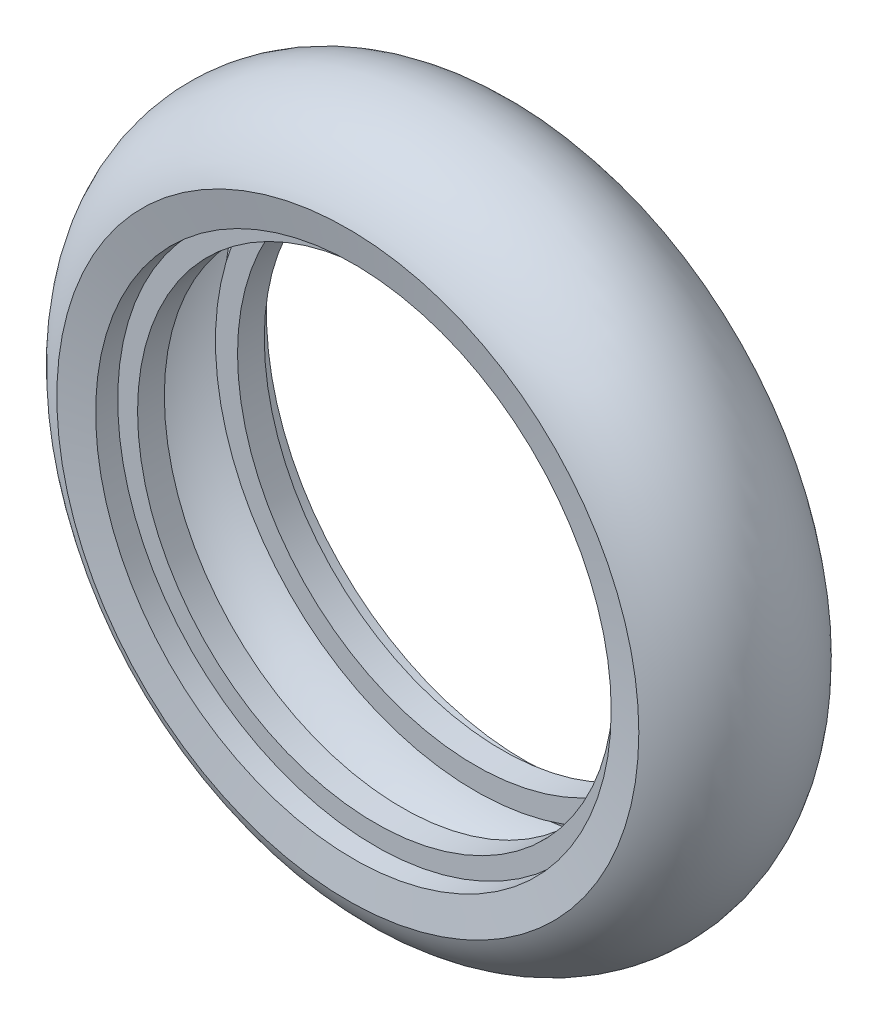
ISO-10303-21;
HEADER;
FILE_DESCRIPTION(('STEP AP214'),'2;1');
FILE_NAME('part.step','',(''),(''),'','','');
FILE_SCHEMA(('AUTOMOTIVE_DESIGN { 1 0 10303 214 1 1 1 1 }'));
ENDSEC;
DATA;
#1=APPLICATION_CONTEXT('core data for automotive mechanical design processes');
#2=APPLICATION_PROTOCOL_DEFINITION('international standard','automotive_design',2000,#1);
#3=PRODUCT_CONTEXT('',#1,'mechanical');
#4=PRODUCT('Part','Part','',(#3));
#5=PRODUCT_RELATED_PRODUCT_CATEGORY('part','',(#4));
#6=PRODUCT_DEFINITION_FORMATION('','',#4);
#7=PRODUCT_DEFINITION_CONTEXT('part definition',#1,'design');
#8=PRODUCT_DEFINITION('design','',#6,#7);
#9=PRODUCT_DEFINITION_SHAPE('','',#8);
#10=(LENGTH_UNIT() NAMED_UNIT(*) SI_UNIT(.MILLI.,.METRE.));
#11=(NAMED_UNIT(*) PLANE_ANGLE_UNIT() SI_UNIT($,.RADIAN.));
#12=(NAMED_UNIT(*) SI_UNIT($,.STERADIAN.) SOLID_ANGLE_UNIT());
#13=UNCERTAINTY_MEASURE_WITH_UNIT(LENGTH_MEASURE(1.E-05),#10,'distance_accuracy_value','');
#14=(GEOMETRIC_REPRESENTATION_CONTEXT(3) GLOBAL_UNCERTAINTY_ASSIGNED_CONTEXT((#13)) GLOBAL_UNIT_ASSIGNED_CONTEXT((#10,
#11,#12)) REPRESENTATION_CONTEXT('',''));
#15=CARTESIAN_POINT('',(0.,0.,0.));
#16=DIRECTION('',(0.,0.,1.));
#17=DIRECTION('',(1.,0.,0.));
#18=AXIS2_PLACEMENT_3D('',#15,#16,#17);
#19=CARTESIAN_POINT('',(0.,45.875,0.));
#20=DIRECTION('',(0.,0.,1.));
#21=DIRECTION('',(1.,0.,0.));
#22=AXIS2_PLACEMENT_3D('',#19,#20,#21);
#23=TOROIDAL_SURFACE('',#22,45.875,17.875);
#24=CARTESIAN_POINT('',(0.,45.875,-16.5));
#25=DIRECTION('',(0.,0.,1.));
#26=DIRECTION('',(1.,0.,0.));
#27=AXIS2_PLACEMENT_3D('',#24,#25,#26);
#28=CIRCLE('',#27,52.75);
#29=CARTESIAN_POINT('',(52.75,45.875,-16.5));
#30=VERTEX_POINT('',#29);
#31=EDGE_CURVE('E10',#30,#30,#28,.T.);
#32=ORIENTED_EDGE('',*,*,#31,.T.);
#33=EDGE_LOOP('',(#32));
#34=FACE_BOUND('',#33,.T.);
#35=CARTESIAN_POINT('',(0.,45.875,16.5));
#36=DIRECTION('',(0.,0.,1.));
#37=DIRECTION('',(1.,0.,0.));
#38=AXIS2_PLACEMENT_3D('',#35,#36,#37);
#39=CIRCLE('',#38,52.75);
#40=CARTESIAN_POINT('',(52.75,45.875,16.5));
#41=VERTEX_POINT('',#40);
#42=EDGE_CURVE('E82',#41,#41,#39,.T.);
#43=ORIENTED_EDGE('',*,*,#42,.F.);
#44=EDGE_LOOP('',(#43));
#45=FACE_BOUND('',#44,.T.);
#46=ADVANCED_FACE('F30',(#34,#45),#23,.T.);
#47=CARTESIAN_POINT('',(0.,45.875,-16.5));
#48=DIRECTION('',(0.,0.,-1.));
#49=DIRECTION('',(-1.,0.,0.));
#50=AXIS2_PLACEMENT_3D('',#47,#48,#49);
#51=CONICAL_SURFACE('',#50,52.75,1.40376263747532);
#52=CARTESIAN_POINT('',(0.,45.875,-15.485));
#53=DIRECTION('',(0.,0.,1.));
#54=DIRECTION('',(1.,0.,0.));
#55=AXIS2_PLACEMENT_3D('',#52,#53,#54);
#56=CIRCLE('',#55,46.73);
#57=CARTESIAN_POINT('',(46.73,45.875,-15.485));
#58=VERTEX_POINT('',#57);
#59=EDGE_CURVE('E36',#58,#58,#56,.T.);
#60=ORIENTED_EDGE('',*,*,#59,.T.);
#61=EDGE_LOOP('',(#60));
#62=FACE_BOUND('',#61,.T.);
#63=ORIENTED_EDGE('',*,*,#31,.F.);
#64=EDGE_LOOP('',(#63));
#65=FACE_BOUND('',#64,.T.);
#66=ADVANCED_FACE('F90',(#62,#65),#51,.F.);
#67=CARTESIAN_POINT('',(0.,45.875,83.1369947680119));
#68=DIRECTION('',(0.,0.,1.));
#69=DIRECTION('',(1.,0.,0.));
#70=AXIS2_PLACEMENT_3D('',#67,#68,#69);
#71=CYLINDRICAL_SURFACE('',#70,46.73);
#72=CARTESIAN_POINT('',(0.,45.875,-11.485));
#73=DIRECTION('',(0.,0.,1.));
#74=DIRECTION('',(1.,0.,0.));
#75=AXIS2_PLACEMENT_3D('',#72,#73,#74);
#76=CIRCLE('',#75,46.73);
#77=CARTESIAN_POINT('',(46.73,45.875,-11.485));
#78=VERTEX_POINT('',#77);
#79=EDGE_CURVE('E40',#78,#78,#76,.T.);
#80=ORIENTED_EDGE('',*,*,#79,.T.);
#81=EDGE_LOOP('',(#80));
#82=FACE_BOUND('',#81,.T.);
#83=ORIENTED_EDGE('',*,*,#59,.F.);
#84=EDGE_LOOP('',(#83));
#85=FACE_BOUND('',#84,.T.);
#86=ADVANCED_FACE('F94',(#82,#85),#71,.F.);
#87=CARTESIAN_POINT('',(0.,-0.855000000000009,-11.485));
#88=DIRECTION('',(0.,0.,-1.));
#89=DIRECTION('',(-1.,0.,0.));
#90=AXIS2_PLACEMENT_3D('',#87,#88,#89);
#91=PLANE('',#90);
#92=CARTESIAN_POINT('',(0.,45.875,-11.485));
#93=DIRECTION('',(0.,0.,1.));
#94=DIRECTION('',(1.,0.,0.));
#95=AXIS2_PLACEMENT_3D('',#92,#93,#94);
#96=CIRCLE('',#95,43.13);
#97=CARTESIAN_POINT('',(43.13,45.875,-11.485));
#98=VERTEX_POINT('',#97);
#99=EDGE_CURVE('E44',#98,#98,#96,.T.);
#100=ORIENTED_EDGE('',*,*,#99,.T.);
#101=EDGE_LOOP('',(#100));
#102=FACE_BOUND('',#101,.T.);
#103=ORIENTED_EDGE('',*,*,#79,.F.);
#104=EDGE_LOOP('',(#103));
#105=FACE_BOUND('',#104,.T.);
#106=ADVANCED_FACE('F98',(#102,#105),#91,.T.);
#107=CARTESIAN_POINT('',(0.,45.875,83.1369947680119));
#108=DIRECTION('',(0.,0.,1.));
#109=DIRECTION('',(1.,0.,0.));
#110=AXIS2_PLACEMENT_3D('',#107,#108,#109);
#111=CYLINDRICAL_SURFACE('',#110,43.13);
#112=CARTESIAN_POINT('',(0.,45.875,-6.635));
#113=DIRECTION('',(0.,0.,1.));
#114=DIRECTION('',(1.,0.,0.));
#115=AXIS2_PLACEMENT_3D('',#112,#113,#114);
#116=CIRCLE('',#115,43.13);
#117=CARTESIAN_POINT('',(43.13,45.875,-6.635));
#118=VERTEX_POINT('',#117);
#119=EDGE_CURVE('E49',#118,#118,#116,.T.);
#120=ORIENTED_EDGE('',*,*,#119,.T.);
#121=EDGE_LOOP('',(#120));
#122=FACE_BOUND('',#121,.T.);
#123=ORIENTED_EDGE('',*,*,#99,.F.);
#124=EDGE_LOOP('',(#123));
#125=FACE_BOUND('',#124,.T.);
#126=ADVANCED_FACE('F105',(#122,#125),#111,.F.);
#127=CARTESIAN_POINT('',(0.,2.74499999999999,-6.635));
#128=DIRECTION('',(0.,0.,1.));
#129=DIRECTION('',(1.,0.,0.));
#130=AXIS2_PLACEMENT_3D('',#127,#128,#129);
#131=PLANE('',#130);
#132=CARTESIAN_POINT('',(0.,45.875,-6.635));
#133=DIRECTION('',(0.,0.,1.));
#134=DIRECTION('',(1.,0.,0.));
#135=AXIS2_PLACEMENT_3D('',#132,#133,#134);
#136=CIRCLE('',#135,47.13);
#137=CARTESIAN_POINT('',(47.13,45.875,-6.635));
#138=VERTEX_POINT('',#137);
#139=EDGE_CURVE('E52',#138,#138,#136,.T.);
#140=ORIENTED_EDGE('',*,*,#139,.T.);
#141=EDGE_LOOP('',(#140));
#142=FACE_BOUND('',#141,.T.);
#143=ORIENTED_EDGE('',*,*,#119,.F.);
#144=EDGE_LOOP('',(#143));
#145=FACE_BOUND('',#144,.T.);
#146=ADVANCED_FACE('F109',(#142,#145),#131,.T.);
#147=CARTESIAN_POINT('',(0.,45.875,-6.635));
#148=DIRECTION('',(0.,0.,-1.));
#149=DIRECTION('',(-1.,0.,0.));
#150=AXIS2_PLACEMENT_3D('',#147,#148,#149);
#151=CONICAL_SURFACE('',#150,47.13,0.0167632485963682);
#152=CARTESIAN_POINT('',(0.,45.875,-12.5267531674819));
#153=DIRECTION('',(0.,0.,1.));
#154=DIRECTION('',(1.,0.,0.));
#155=AXIS2_PLACEMENT_3D('',#152,#153,#154);
#156=CIRCLE('',#155,47.2287741752502);
#157=CARTESIAN_POINT('',(47.2287741752502,45.875,-12.5267531674819));
#158=VERTEX_POINT('',#157);
#159=EDGE_CURVE('E55',#158,#158,#156,.T.);
#160=ORIENTED_EDGE('',*,*,#159,.T.);
#161=EDGE_LOOP('',(#160));
#162=FACE_BOUND('',#161,.T.);
#163=ORIENTED_EDGE('',*,*,#139,.F.);
#164=EDGE_LOOP('',(#163));
#165=FACE_BOUND('',#164,.T.);
#166=ADVANCED_FACE('F113',(#162,#165),#151,.T.);
#167=CARTESIAN_POINT('',(0.,45.875,-12.5267531674819));
#168=DIRECTION('',(0.,0.,-1.));
#169=DIRECTION('',(-1.,0.,0.));
#170=AXIS2_PLACEMENT_3D('',#167,#168,#169);
#171=CONICAL_SURFACE('',#170,47.2287741752502,1.40376263747532);
#172=CARTESIAN_POINT('',(0.,45.875,-13.390622260788));
#173=DIRECTION('',(0.,0.,1.));
#174=DIRECTION('',(1.,0.,0.));
#175=AXIS2_PLACEMENT_3D('',#172,#173,#174);
#176=CIRCLE('',#175,52.3524115562382);
#177=CARTESIAN_POINT('',(52.3524115562382,45.875,-13.390622260788));
#178=VERTEX_POINT('',#177);
#179=EDGE_CURVE('E58',#178,#178,#176,.T.);
#180=ORIENTED_EDGE('',*,*,#179,.T.);
#181=EDGE_LOOP('',(#180));
#182=FACE_BOUND('',#181,.T.);
#183=ORIENTED_EDGE('',*,*,#159,.F.);
#184=EDGE_LOOP('',(#183));
#185=FACE_BOUND('',#184,.T.);
#186=ADVANCED_FACE('F117',(#182,#185),#171,.T.);
#187=CARTESIAN_POINT('',(0.,45.875,0.));
#188=DIRECTION('',(0.,0.,1.));
#189=DIRECTION('',(1.,0.,0.));
#190=AXIS2_PLACEMENT_3D('',#187,#188,#189);
#191=TOROIDAL_SURFACE('',#190,45.875,14.875);
#192=CARTESIAN_POINT('',(0.,45.875,13.390622260788));
#193=DIRECTION('',(0.,0.,1.));
#194=DIRECTION('',(1.,0.,0.));
#195=AXIS2_PLACEMENT_3D('',#192,#193,#194);
#196=CIRCLE('',#195,52.3524115562382);
#197=CARTESIAN_POINT('',(52.3524115562382,45.875,13.390622260788));
#198=VERTEX_POINT('',#197);
#199=EDGE_CURVE('E61',#198,#198,#196,.T.);
#200=ORIENTED_EDGE('',*,*,#199,.T.);
#201=EDGE_LOOP('',(#200));
#202=FACE_BOUND('',#201,.T.);
#203=ORIENTED_EDGE('',*,*,#179,.F.);
#204=EDGE_LOOP('',(#203));
#205=FACE_BOUND('',#204,.T.);
#206=ADVANCED_FACE('F121',(#202,#205),#191,.F.);
#207=CARTESIAN_POINT('',(0.,45.875,13.390622260788));
#208=DIRECTION('',(0.,0.,1.));
#209=DIRECTION('',(1.,0.,0.));
#210=AXIS2_PLACEMENT_3D('',#207,#208,#209);
#211=CONICAL_SURFACE('',#210,52.3524115562382,1.40376263747532);
#212=CARTESIAN_POINT('',(0.,45.875,12.5267531674819));
#213=DIRECTION('',(0.,0.,1.));
#214=DIRECTION('',(1.,0.,0.));
#215=AXIS2_PLACEMENT_3D('',#212,#213,#214);
#216=CIRCLE('',#215,47.2287741752502);
#217=CARTESIAN_POINT('',(47.2287741752502,45.875,12.5267531674819));
#218=VERTEX_POINT('',#217);
#219=EDGE_CURVE('E64',#218,#218,#216,.T.);
#220=ORIENTED_EDGE('',*,*,#219,.T.);
#221=EDGE_LOOP('',(#220));
#222=FACE_BOUND('',#221,.T.);
#223=ORIENTED_EDGE('',*,*,#199,.F.);
#224=EDGE_LOOP('',(#223));
#225=FACE_BOUND('',#224,.T.);
#226=ADVANCED_FACE('F125',(#222,#225),#211,.T.);
#227=CARTESIAN_POINT('',(0.,45.875,12.5267531674819));
#228=DIRECTION('',(0.,0.,1.));
#229=DIRECTION('',(1.,0.,0.));
#230=AXIS2_PLACEMENT_3D('',#227,#228,#229);
#231=CONICAL_SURFACE('',#230,47.2287741752502,0.0167632485963682);
#232=CARTESIAN_POINT('',(0.,45.875,6.635));
#233=DIRECTION('',(0.,0.,1.));
#234=DIRECTION('',(1.,0.,0.));
#235=AXIS2_PLACEMENT_3D('',#232,#233,#234);
#236=CIRCLE('',#235,47.13);
#237=CARTESIAN_POINT('',(47.13,45.875,6.635));
#238=VERTEX_POINT('',#237);
#239=EDGE_CURVE('E67',#238,#238,#236,.T.);
#240=ORIENTED_EDGE('',*,*,#239,.T.);
#241=EDGE_LOOP('',(#240));
#242=FACE_BOUND('',#241,.T.);
#243=ORIENTED_EDGE('',*,*,#219,.F.);
#244=EDGE_LOOP('',(#243));
#245=FACE_BOUND('',#244,.T.);
#246=ADVANCED_FACE('F129',(#242,#245),#231,.T.);
#247=CARTESIAN_POINT('',(0.,2.74499999999999,6.635));
#248=DIRECTION('',(0.,0.,-1.));
#249=DIRECTION('',(-1.,0.,0.));
#250=AXIS2_PLACEMENT_3D('',#247,#248,#249);
#251=PLANE('',#250);
#252=CARTESIAN_POINT('',(0.,45.875,6.635));
#253=DIRECTION('',(0.,0.,1.));
#254=DIRECTION('',(1.,0.,0.));
#255=AXIS2_PLACEMENT_3D('',#252,#253,#254);
#256=CIRCLE('',#255,43.13);
#257=CARTESIAN_POINT('',(43.13,45.875,6.635));
#258=VERTEX_POINT('',#257);
#259=EDGE_CURVE('E70',#258,#258,#256,.T.);
#260=ORIENTED_EDGE('',*,*,#259,.T.);
#261=EDGE_LOOP('',(#260));
#262=FACE_BOUND('',#261,.T.);
#263=ORIENTED_EDGE('',*,*,#239,.F.);
#264=EDGE_LOOP('',(#263));
#265=FACE_BOUND('',#264,.T.);
#266=ADVANCED_FACE('F133',(#262,#265),#251,.T.);
#267=CARTESIAN_POINT('',(0.,45.875,83.1369947680119));
#268=DIRECTION('',(0.,0.,1.));
#269=DIRECTION('',(1.,0.,0.));
#270=AXIS2_PLACEMENT_3D('',#267,#268,#269);
#271=CYLINDRICAL_SURFACE('',#270,43.13);
#272=CARTESIAN_POINT('',(0.,45.875,11.485));
#273=DIRECTION('',(0.,0.,1.));
#274=DIRECTION('',(1.,0.,0.));
#275=AXIS2_PLACEMENT_3D('',#272,#273,#274);
#276=CIRCLE('',#275,43.13);
#277=CARTESIAN_POINT('',(43.13,45.875,11.485));
#278=VERTEX_POINT('',#277);
#279=EDGE_CURVE('E73',#278,#278,#276,.T.);
#280=ORIENTED_EDGE('',*,*,#279,.T.);
#281=EDGE_LOOP('',(#280));
#282=FACE_BOUND('',#281,.T.);
#283=ORIENTED_EDGE('',*,*,#259,.F.);
#284=EDGE_LOOP('',(#283));
#285=FACE_BOUND('',#284,.T.);
#286=ADVANCED_FACE('F137',(#282,#285),#271,.F.);
#287=CARTESIAN_POINT('',(0.,-0.855000000000009,11.485));
#288=DIRECTION('',(0.,0.,1.));
#289=DIRECTION('',(1.,0.,0.));
#290=AXIS2_PLACEMENT_3D('',#287,#288,#289);
#291=PLANE('',#290);
#292=CARTESIAN_POINT('',(0.,45.875,11.485));
#293=DIRECTION('',(0.,0.,1.));
#294=DIRECTION('',(1.,0.,0.));
#295=AXIS2_PLACEMENT_3D('',#292,#293,#294);
#296=CIRCLE('',#295,46.73);
#297=CARTESIAN_POINT('',(46.73,45.875,11.485));
#298=VERTEX_POINT('',#297);
#299=EDGE_CURVE('E76',#298,#298,#296,.T.);
#300=ORIENTED_EDGE('',*,*,#299,.T.);
#301=EDGE_LOOP('',(#300));
#302=FACE_BOUND('',#301,.T.);
#303=ORIENTED_EDGE('',*,*,#279,.F.);
#304=EDGE_LOOP('',(#303));
#305=FACE_BOUND('',#304,.T.);
#306=ADVANCED_FACE('F141',(#302,#305),#291,.T.);
#307=CARTESIAN_POINT('',(0.,45.875,83.1369947680119));
#308=DIRECTION('',(0.,0.,1.));
#309=DIRECTION('',(1.,0.,0.));
#310=AXIS2_PLACEMENT_3D('',#307,#308,#309);
#311=CYLINDRICAL_SURFACE('',#310,46.73);
#312=CARTESIAN_POINT('',(0.,45.875,15.485));
#313=DIRECTION('',(0.,0.,1.));
#314=DIRECTION('',(1.,0.,0.));
#315=AXIS2_PLACEMENT_3D('',#312,#313,#314);
#316=CIRCLE('',#315,46.73);
#317=CARTESIAN_POINT('',(46.73,45.875,15.485));
#318=VERTEX_POINT('',#317);
#319=EDGE_CURVE('E79',#318,#318,#316,.T.);
#320=ORIENTED_EDGE('',*,*,#319,.T.);
#321=EDGE_LOOP('',(#320));
#322=FACE_BOUND('',#321,.T.);
#323=ORIENTED_EDGE('',*,*,#299,.F.);
#324=EDGE_LOOP('',(#323));
#325=FACE_BOUND('',#324,.T.);
#326=ADVANCED_FACE('F145',(#322,#325),#311,.F.);
#327=CARTESIAN_POINT('',(0.,45.875,15.485));
#328=DIRECTION('',(0.,0.,1.));
#329=DIRECTION('',(1.,0.,0.));
#330=AXIS2_PLACEMENT_3D('',#327,#328,#329);
#331=CONICAL_SURFACE('',#330,46.73,1.40376263747532);
#332=ORIENTED_EDGE('',*,*,#42,.T.);
#333=EDGE_LOOP('',(#332));
#334=FACE_BOUND('',#333,.T.);
#335=ORIENTED_EDGE('',*,*,#319,.F.);
#336=EDGE_LOOP('',(#335));
#337=FACE_BOUND('',#336,.T.);
#338=ADVANCED_FACE('F86',(#334,#337),#331,.F.);
#339=CLOSED_SHELL('',(#46,#66,#86,#106,#126,#146,#166,#186,#206,#226,#246,#266,#286,#306,#326,#338));
#340=MANIFOLD_SOLID_BREP('B2',#339);
#341=ADVANCED_BREP_SHAPE_REPRESENTATION('',(#18,#340),#14);
#342=SHAPE_DEFINITION_REPRESENTATION(#9,#341);
ENDSEC;
END-ISO-10303-21;
